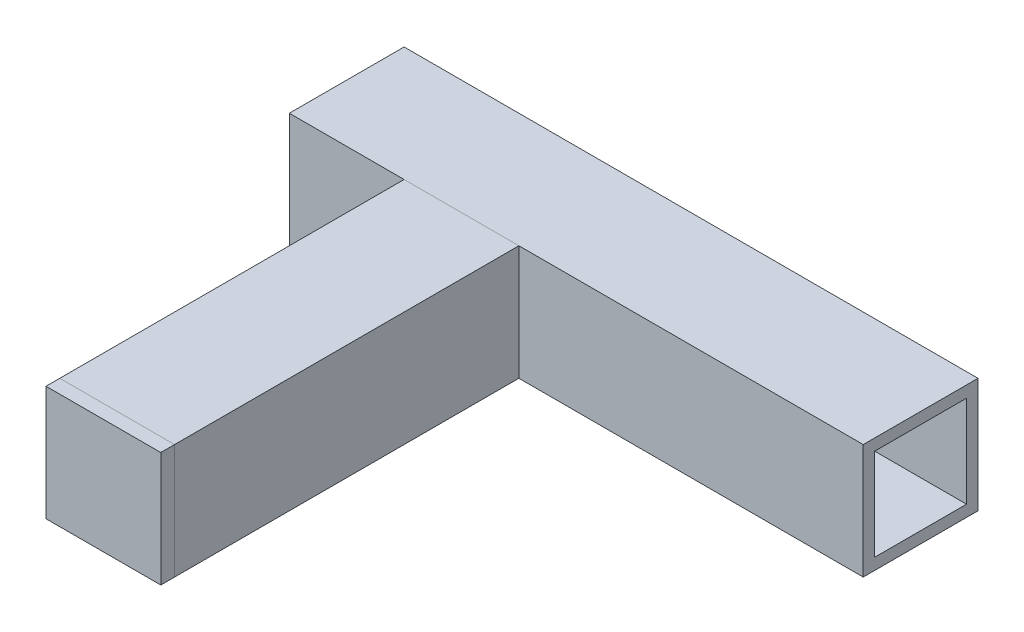
ISO-10303-21;
HEADER;
FILE_DESCRIPTION(('STEP AP214'),'2;1');
FILE_NAME('part.step','',(''),(''),'','','');
FILE_SCHEMA(('AUTOMOTIVE_DESIGN { 1 0 10303 214 1 1 1 1 }'));
ENDSEC;
DATA;
#1=APPLICATION_CONTEXT('core data for automotive mechanical design processes');
#2=APPLICATION_PROTOCOL_DEFINITION('international standard','automotive_design',2000,#1);
#3=PRODUCT_CONTEXT('',#1,'mechanical');
#4=PRODUCT('Part','Part','',(#3));
#5=PRODUCT_RELATED_PRODUCT_CATEGORY('part','',(#4));
#6=PRODUCT_DEFINITION_FORMATION('','',#4);
#7=PRODUCT_DEFINITION_CONTEXT('part definition',#1,'design');
#8=PRODUCT_DEFINITION('design','',#6,#7);
#9=PRODUCT_DEFINITION_SHAPE('','',#8);
#10=(LENGTH_UNIT() NAMED_UNIT(*) SI_UNIT(.MILLI.,.METRE.));
#11=(NAMED_UNIT(*) PLANE_ANGLE_UNIT() SI_UNIT($,.RADIAN.));
#12=(NAMED_UNIT(*) SI_UNIT($,.STERADIAN.) SOLID_ANGLE_UNIT());
#13=UNCERTAINTY_MEASURE_WITH_UNIT(LENGTH_MEASURE(1.E-05),#10,'distance_accuracy_value','');
#14=(GEOMETRIC_REPRESENTATION_CONTEXT(3) GLOBAL_UNCERTAINTY_ASSIGNED_CONTEXT((#13)) GLOBAL_UNIT_ASSIGNED_CONTEXT((#10,
#11,#12)) REPRESENTATION_CONTEXT('',''));
#15=CARTESIAN_POINT('',(0.,0.,0.));
#16=DIRECTION('',(0.,0.,1.));
#17=DIRECTION('',(1.,0.,0.));
#18=AXIS2_PLACEMENT_3D('',#15,#16,#17);
#19=CARTESIAN_POINT('',(24.99995,-24.99995,181.));
#20=DIRECTION('',(-1.,0.,0.));
#21=DIRECTION('',(0.,0.,1.));
#22=AXIS2_PLACEMENT_3D('',#19,#20,#21);
#23=PLANE('',#22);
#24=DIRECTION('',(0.,1.,0.));
#25=VECTOR('',#24,1.);
#26=CARTESIAN_POINT('',(24.99995,-24.99995,175.));
#27=LINE('',#26,#25);
#28=CARTESIAN_POINT('',(24.99995,-24.99995,175.));
#29=VERTEX_POINT('',#28);
#30=CARTESIAN_POINT('',(24.99995,24.99995,175.));
#31=VERTEX_POINT('',#30);
#32=EDGE_CURVE('P0_E79',#29,#31,#27,.T.);
#33=ORIENTED_EDGE('',*,*,#32,.T.);
#34=DIRECTION('',(0.,0.,-1.));
#35=VECTOR('',#34,1.);
#36=CARTESIAN_POINT('',(24.99995,24.99995,181.));
#37=LINE('',#36,#35);
#38=CARTESIAN_POINT('',(24.99995,24.99995,181.));
#39=VERTEX_POINT('',#38);
#40=EDGE_CURVE('P0_E11',#39,#31,#37,.T.);
#41=ORIENTED_EDGE('',*,*,#40,.F.);
#42=DIRECTION('',(0.,1.,0.));
#43=VECTOR('',#42,1.);
#44=CARTESIAN_POINT('',(24.99995,-24.99995,181.));
#45=LINE('',#44,#43);
#46=CARTESIAN_POINT('',(24.99995,-24.99995,181.));
#47=VERTEX_POINT('',#46);
#48=EDGE_CURVE('P0_E67',#47,#39,#45,.T.);
#49=ORIENTED_EDGE('',*,*,#48,.F.);
#50=DIRECTION('',(0.,0.,-1.));
#51=VECTOR('',#50,1.);
#52=CARTESIAN_POINT('',(24.99995,-24.99995,181.));
#53=LINE('',#52,#51);
#54=EDGE_CURVE('P0_E75',#47,#29,#53,.T.);
#55=ORIENTED_EDGE('',*,*,#54,.T.);
#56=EDGE_LOOP('',(#33,#41,#49,#55));
#57=FACE_BOUND('',#56,.T.);
#58=ADVANCED_FACE('P0_F16',(#57),#23,.F.);
#59=CARTESIAN_POINT('',(-24.99995,24.99995,181.));
#60=DIRECTION('',(0.,-1.,0.));
#61=DIRECTION('',(0.,0.,-1.));
#62=AXIS2_PLACEMENT_3D('',#59,#60,#61);
#63=PLANE('',#62);
#64=DIRECTION('',(-1.,0.,0.));
#65=VECTOR('',#64,1.);
#66=CARTESIAN_POINT('',(-24.99995,24.99995,175.));
#67=LINE('',#66,#65);
#68=CARTESIAN_POINT('',(-24.99995,24.99995,175.));
#69=VERTEX_POINT('',#68);
#70=EDGE_CURVE('P0_E71',#31,#69,#67,.T.);
#71=ORIENTED_EDGE('',*,*,#70,.T.);
#72=DIRECTION('',(0.,0.,-1.));
#73=VECTOR('',#72,1.);
#74=CARTESIAN_POINT('',(-24.99995,24.99995,181.));
#75=LINE('',#74,#73);
#76=CARTESIAN_POINT('',(-24.99995,24.99995,181.));
#77=VERTEX_POINT('',#76);
#78=EDGE_CURVE('P0_E24',#77,#69,#75,.T.);
#79=ORIENTED_EDGE('',*,*,#78,.F.);
#80=DIRECTION('',(-1.,0.,0.));
#81=VECTOR('',#80,1.);
#82=CARTESIAN_POINT('',(-24.99995,24.99995,181.));
#83=LINE('',#82,#81);
#84=EDGE_CURVE('P0_E62',#39,#77,#83,.T.);
#85=ORIENTED_EDGE('',*,*,#84,.F.);
#86=ORIENTED_EDGE('',*,*,#40,.T.);
#87=EDGE_LOOP('',(#71,#79,#85,#86));
#88=FACE_BOUND('',#87,.T.);
#89=ADVANCED_FACE('P0_F70',(#88),#63,.F.);
#90=CARTESIAN_POINT('',(-24.99995,-24.99995,181.));
#91=DIRECTION('',(1.,0.,0.));
#92=DIRECTION('',(0.,0.,-1.));
#93=AXIS2_PLACEMENT_3D('',#90,#91,#92);
#94=PLANE('',#93);
#95=DIRECTION('',(0.,-1.,0.));
#96=VECTOR('',#95,1.);
#97=CARTESIAN_POINT('',(-24.99995,-24.99995,175.));
#98=LINE('',#97,#96);
#99=CARTESIAN_POINT('',(-24.99995,-24.99995,175.));
#100=VERTEX_POINT('',#99);
#101=EDGE_CURVE('P0_E49',#69,#100,#98,.T.);
#102=ORIENTED_EDGE('',*,*,#101,.T.);
#103=DIRECTION('',(0.,0.,-1.));
#104=VECTOR('',#103,1.);
#105=CARTESIAN_POINT('',(-24.99995,-24.99995,181.));
#106=LINE('',#105,#104);
#107=CARTESIAN_POINT('',(-24.99995,-24.99995,181.));
#108=VERTEX_POINT('',#107);
#109=EDGE_CURVE('P0_E72',#108,#100,#106,.T.);
#110=ORIENTED_EDGE('',*,*,#109,.F.);
#111=DIRECTION('',(0.,-1.,0.));
#112=VECTOR('',#111,1.);
#113=CARTESIAN_POINT('',(-24.99995,-24.99995,181.));
#114=LINE('',#113,#112);
#115=EDGE_CURVE('P0_E65',#77,#108,#114,.T.);
#116=ORIENTED_EDGE('',*,*,#115,.F.);
#117=ORIENTED_EDGE('',*,*,#78,.T.);
#118=EDGE_LOOP('',(#102,#110,#116,#117));
#119=FACE_BOUND('',#118,.T.);
#120=ADVANCED_FACE('P0_F73',(#119),#94,.F.);
#121=CARTESIAN_POINT('',(-24.99995,-24.99995,181.));
#122=DIRECTION('',(0.,1.,0.));
#123=DIRECTION('',(0.,0.,1.));
#124=AXIS2_PLACEMENT_3D('',#121,#122,#123);
#125=PLANE('',#124);
#126=DIRECTION('',(1.,0.,0.));
#127=VECTOR('',#126,1.);
#128=CARTESIAN_POINT('',(-24.99995,-24.99995,175.));
#129=LINE('',#128,#127);
#130=EDGE_CURVE('P0_E55',#100,#29,#129,.T.);
#131=ORIENTED_EDGE('',*,*,#130,.T.);
#132=ORIENTED_EDGE('',*,*,#54,.F.);
#133=DIRECTION('',(1.,0.,0.));
#134=VECTOR('',#133,1.);
#135=CARTESIAN_POINT('',(-24.99995,-24.99995,181.));
#136=LINE('',#135,#134);
#137=EDGE_CURVE('P0_E32',#108,#47,#136,.T.);
#138=ORIENTED_EDGE('',*,*,#137,.F.);
#139=ORIENTED_EDGE('',*,*,#109,.T.);
#140=EDGE_LOOP('',(#131,#132,#138,#139));
#141=FACE_BOUND('',#140,.T.);
#142=ADVANCED_FACE('P0_F86',(#141),#125,.F.);
#143=CARTESIAN_POINT('',(0.,0.,181.));
#144=DIRECTION('',(0.,0.,-1.));
#145=DIRECTION('',(-1.,0.,0.));
#146=AXIS2_PLACEMENT_3D('',#143,#144,#145);
#147=PLANE('',#146);
#148=ORIENTED_EDGE('',*,*,#48,.T.);
#149=ORIENTED_EDGE('',*,*,#84,.T.);
#150=ORIENTED_EDGE('',*,*,#115,.T.);
#151=ORIENTED_EDGE('',*,*,#137,.T.);
#152=EDGE_LOOP('',(#148,#149,#150,#151));
#153=FACE_BOUND('',#152,.T.);
#154=ADVANCED_FACE('P0_F63',(#153),#147,.F.);
#155=CARTESIAN_POINT('',(0.,0.,175.));
#156=DIRECTION('',(0.,0.,-1.));
#157=DIRECTION('',(-1.,0.,0.));
#158=AXIS2_PLACEMENT_3D('',#155,#156,#157);
#159=PLANE('',#158);
#160=ORIENTED_EDGE('',*,*,#32,.F.);
#161=ORIENTED_EDGE('',*,*,#130,.F.);
#162=ORIENTED_EDGE('',*,*,#101,.F.);
#163=ORIENTED_EDGE('',*,*,#70,.F.);
#164=EDGE_LOOP('',(#160,#161,#162,#163));
#165=FACE_BOUND('',#164,.T.);
#166=ADVANCED_FACE('P0_F89',(#165),#159,.T.);
#167=CLOSED_SHELL('',(#58,#89,#120,#142,#154,#166));
#168=MANIFOLD_SOLID_BREP('P0_B1',#167);
#169=CARTESIAN_POINT('',(0.,0.,175.));
#170=DIRECTION('',(0.,0.,1.));
#171=DIRECTION('',(1.,0.,0.));
#172=AXIS2_PLACEMENT_3D('',#169,#170,#171);
#173=PLANE('',#172);
#174=DIRECTION('',(0.,-1.,0.));
#175=VECTOR('',#174,1.);
#176=CARTESIAN_POINT('',(-25.,25.,175.));
#177=LINE('',#176,#175);
#178=CARTESIAN_POINT('',(-25.,25.,175.));
#179=VERTEX_POINT('',#178);
#180=CARTESIAN_POINT('',(-25.,-25.,175.));
#181=VERTEX_POINT('',#180);
#182=EDGE_CURVE('P1_E117',#179,#181,#177,.T.);
#183=ORIENTED_EDGE('',*,*,#182,.T.);
#184=DIRECTION('',(1.,0.,0.));
#185=VECTOR('',#184,1.);
#186=CARTESIAN_POINT('',(-25.,-25.,175.));
#187=LINE('',#186,#185);
#188=CARTESIAN_POINT('',(25.,-25.,175.));
#189=VERTEX_POINT('',#188);
#190=EDGE_CURVE('P1_E120',#181,#189,#187,.T.);
#191=ORIENTED_EDGE('',*,*,#190,.T.);
#192=DIRECTION('',(0.,1.,0.));
#193=VECTOR('',#192,1.);
#194=CARTESIAN_POINT('',(25.,25.,175.));
#195=LINE('',#194,#193);
#196=CARTESIAN_POINT('',(25.,25.,175.));
#197=VERTEX_POINT('',#196);
#198=EDGE_CURVE('P1_E123',#189,#197,#195,.T.);
#199=ORIENTED_EDGE('',*,*,#198,.T.);
#200=DIRECTION('',(-1.,0.,0.));
#201=VECTOR('',#200,1.);
#202=CARTESIAN_POINT('',(-25.,25.,175.));
#203=LINE('',#202,#201);
#204=EDGE_CURVE('P1_E125',#197,#179,#203,.T.);
#205=ORIENTED_EDGE('',*,*,#204,.T.);
#206=EDGE_LOOP('',(#183,#191,#199,#205));
#207=FACE_BOUND('',#206,.T.);
#208=DIRECTION('',(0.,-1.,0.));
#209=VECTOR('',#208,1.);
#210=CARTESIAN_POINT('',(-20.,20.,175.));
#211=LINE('',#210,#209);
#212=CARTESIAN_POINT('',(-20.,20.,175.));
#213=VERTEX_POINT('',#212);
#214=CARTESIAN_POINT('',(-20.,-20.,175.));
#215=VERTEX_POINT('',#214);
#216=EDGE_CURVE('P1_E89',#213,#215,#211,.T.);
#217=ORIENTED_EDGE('',*,*,#216,.F.);
#218=DIRECTION('',(-1.,0.,0.));
#219=VECTOR('',#218,1.);
#220=CARTESIAN_POINT('',(-20.,20.,175.));
#221=LINE('',#220,#219);
#222=CARTESIAN_POINT('',(20.,20.,175.));
#223=VERTEX_POINT('',#222);
#224=EDGE_CURVE('P1_E81',#223,#213,#221,.T.);
#225=ORIENTED_EDGE('',*,*,#224,.F.);
#226=DIRECTION('',(0.,1.,0.));
#227=VECTOR('',#226,1.);
#228=CARTESIAN_POINT('',(20.,20.,175.));
#229=LINE('',#228,#227);
#230=CARTESIAN_POINT('',(20.,-20.,175.));
#231=VERTEX_POINT('',#230);
#232=EDGE_CURVE('P1_E103',#231,#223,#229,.T.);
#233=ORIENTED_EDGE('',*,*,#232,.F.);
#234=DIRECTION('',(1.,0.,0.));
#235=VECTOR('',#234,1.);
#236=CARTESIAN_POINT('',(-20.,-20.,175.));
#237=LINE('',#236,#235);
#238=EDGE_CURVE('P1_E101',#215,#231,#237,.T.);
#239=ORIENTED_EDGE('',*,*,#238,.F.);
#240=EDGE_LOOP('',(#217,#225,#233,#239));
#241=FACE_BOUND('',#240,.T.);
#242=ADVANCED_FACE('P1_F16',(#207,#241),#173,.T.);
#243=CARTESIAN_POINT('',(0.,0.,25.));
#244=DIRECTION('',(0.,0.,1.));
#245=DIRECTION('',(1.,0.,0.));
#246=AXIS2_PLACEMENT_3D('',#243,#244,#245);
#247=PLANE('',#246);
#248=DIRECTION('',(0.,-1.,0.));
#249=VECTOR('',#248,1.);
#250=CARTESIAN_POINT('',(-25.,25.,25.));
#251=LINE('',#250,#249);
#252=CARTESIAN_POINT('',(-25.,25.,25.));
#253=VERTEX_POINT('',#252);
#254=CARTESIAN_POINT('',(-25.,-25.,25.));
#255=VERTEX_POINT('',#254);
#256=EDGE_CURVE('P1_E97',#253,#255,#251,.T.);
#257=ORIENTED_EDGE('',*,*,#256,.F.);
#258=DIRECTION('',(-1.,0.,0.));
#259=VECTOR('',#258,1.);
#260=CARTESIAN_POINT('',(-25.,25.,25.));
#261=LINE('',#260,#259);
#262=CARTESIAN_POINT('',(25.,25.,25.));
#263=VERTEX_POINT('',#262);
#264=EDGE_CURVE('P1_E121',#263,#253,#261,.T.);
#265=ORIENTED_EDGE('',*,*,#264,.F.);
#266=DIRECTION('',(0.,1.,0.));
#267=VECTOR('',#266,1.);
#268=CARTESIAN_POINT('',(25.,25.,25.));
#269=LINE('',#268,#267);
#270=CARTESIAN_POINT('',(25.,-25.,25.));
#271=VERTEX_POINT('',#270);
#272=EDGE_CURVE('P1_E132',#271,#263,#269,.T.);
#273=ORIENTED_EDGE('',*,*,#272,.F.);
#274=DIRECTION('',(1.,0.,0.));
#275=VECTOR('',#274,1.);
#276=CARTESIAN_POINT('',(-25.,-25.,25.));
#277=LINE('',#276,#275);
#278=EDGE_CURVE('P1_E130',#255,#271,#277,.T.);
#279=ORIENTED_EDGE('',*,*,#278,.F.);
#280=EDGE_LOOP('',(#257,#265,#273,#279));
#281=FACE_BOUND('',#280,.T.);
#282=DIRECTION('',(-1.,0.,0.));
#283=VECTOR('',#282,1.);
#284=CARTESIAN_POINT('',(-20.,20.,25.));
#285=LINE('',#284,#283);
#286=CARTESIAN_POINT('',(20.,20.,25.));
#287=VERTEX_POINT('',#286);
#288=CARTESIAN_POINT('',(-20.,20.,25.));
#289=VERTEX_POINT('',#288);
#290=EDGE_CURVE('P1_E39',#287,#289,#285,.T.);
#291=ORIENTED_EDGE('',*,*,#290,.T.);
#292=DIRECTION('',(0.,-1.,0.));
#293=VECTOR('',#292,1.);
#294=CARTESIAN_POINT('',(-20.,20.,25.));
#295=LINE('',#294,#293);
#296=CARTESIAN_POINT('',(-20.,-20.,25.));
#297=VERTEX_POINT('',#296);
#298=EDGE_CURVE('P1_E96',#289,#297,#295,.T.);
#299=ORIENTED_EDGE('',*,*,#298,.T.);
#300=DIRECTION('',(1.,0.,0.));
#301=VECTOR('',#300,1.);
#302=CARTESIAN_POINT('',(-20.,-20.,25.));
#303=LINE('',#302,#301);
#304=CARTESIAN_POINT('',(20.,-20.,25.));
#305=VERTEX_POINT('',#304);
#306=EDGE_CURVE('P1_E109',#297,#305,#303,.T.);
#307=ORIENTED_EDGE('',*,*,#306,.T.);
#308=DIRECTION('',(0.,1.,0.));
#309=VECTOR('',#308,1.);
#310=CARTESIAN_POINT('',(20.,20.,25.));
#311=LINE('',#310,#309);
#312=EDGE_CURVE('P1_E90',#305,#287,#311,.T.);
#313=ORIENTED_EDGE('',*,*,#312,.T.);
#314=EDGE_LOOP('',(#291,#299,#307,#313));
#315=FACE_BOUND('',#314,.T.);
#316=ADVANCED_FACE('P1_F150',(#281,#315),#247,.F.);
#317=CARTESIAN_POINT('',(-25.,25.,175.));
#318=DIRECTION('',(1.,0.,0.));
#319=DIRECTION('',(0.,1.,0.));
#320=AXIS2_PLACEMENT_3D('',#317,#318,#319);
#321=PLANE('',#320);
#322=ORIENTED_EDGE('',*,*,#256,.T.);
#323=DIRECTION('',(0.,0.,-1.));
#324=VECTOR('',#323,1.);
#325=CARTESIAN_POINT('',(-25.,-25.,175.));
#326=LINE('',#325,#324);
#327=EDGE_CURVE('P1_E11',#181,#255,#326,.T.);
#328=ORIENTED_EDGE('',*,*,#327,.F.);
#329=ORIENTED_EDGE('',*,*,#182,.F.);
#330=DIRECTION('',(0.,0.,-1.));
#331=VECTOR('',#330,1.);
#332=CARTESIAN_POINT('',(-25.,25.,175.));
#333=LINE('',#332,#331);
#334=EDGE_CURVE('P1_E127',#179,#253,#333,.T.);
#335=ORIENTED_EDGE('',*,*,#334,.T.);
#336=EDGE_LOOP('',(#322,#328,#329,#335));
#337=FACE_BOUND('',#336,.T.);
#338=ADVANCED_FACE('P1_F18',(#337),#321,.F.);
#339=CARTESIAN_POINT('',(-25.,-25.,175.));
#340=DIRECTION('',(0.,1.,0.));
#341=DIRECTION('',(0.,0.,1.));
#342=AXIS2_PLACEMENT_3D('',#339,#340,#341);
#343=PLANE('',#342);
#344=ORIENTED_EDGE('',*,*,#278,.T.);
#345=DIRECTION('',(0.,0.,-1.));
#346=VECTOR('',#345,1.);
#347=CARTESIAN_POINT('',(25.,-25.,175.));
#348=LINE('',#347,#346);
#349=EDGE_CURVE('P1_E24',#189,#271,#348,.T.);
#350=ORIENTED_EDGE('',*,*,#349,.F.);
#351=ORIENTED_EDGE('',*,*,#190,.F.);
#352=ORIENTED_EDGE('',*,*,#327,.T.);
#353=EDGE_LOOP('',(#344,#350,#351,#352));
#354=FACE_BOUND('',#353,.T.);
#355=ADVANCED_FACE('P1_F160',(#354),#343,.F.);
#356=CARTESIAN_POINT('',(25.,25.,175.));
#357=DIRECTION('',(-1.,0.,0.));
#358=DIRECTION('',(0.,-1.,0.));
#359=AXIS2_PLACEMENT_3D('',#356,#357,#358);
#360=PLANE('',#359);
#361=ORIENTED_EDGE('',*,*,#272,.T.);
#362=DIRECTION('',(0.,0.,-1.));
#363=VECTOR('',#362,1.);
#364=CARTESIAN_POINT('',(25.,25.,175.));
#365=LINE('',#364,#363);
#366=EDGE_CURVE('P1_E137',#197,#263,#365,.T.);
#367=ORIENTED_EDGE('',*,*,#366,.F.);
#368=ORIENTED_EDGE('',*,*,#198,.F.);
#369=ORIENTED_EDGE('',*,*,#349,.T.);
#370=EDGE_LOOP('',(#361,#367,#368,#369));
#371=FACE_BOUND('',#370,.T.);
#372=ADVANCED_FACE('P1_F144',(#371),#360,.F.);
#373=CARTESIAN_POINT('',(-25.,25.,175.));
#374=DIRECTION('',(0.,-1.,0.));
#375=DIRECTION('',(0.,0.,-1.));
#376=AXIS2_PLACEMENT_3D('',#373,#374,#375);
#377=PLANE('',#376);
#378=ORIENTED_EDGE('',*,*,#264,.T.);
#379=ORIENTED_EDGE('',*,*,#334,.F.);
#380=ORIENTED_EDGE('',*,*,#204,.F.);
#381=ORIENTED_EDGE('',*,*,#366,.T.);
#382=EDGE_LOOP('',(#378,#379,#380,#381));
#383=FACE_BOUND('',#382,.T.);
#384=ADVANCED_FACE('P1_F154',(#383),#377,.F.);
#385=CARTESIAN_POINT('',(-20.,20.,175.));
#386=DIRECTION('',(0.,-1.,0.));
#387=DIRECTION('',(0.,0.,-1.));
#388=AXIS2_PLACEMENT_3D('',#385,#386,#387);
#389=PLANE('',#388);
#390=ORIENTED_EDGE('',*,*,#290,.F.);
#391=DIRECTION('',(0.,0.,-1.));
#392=VECTOR('',#391,1.);
#393=CARTESIAN_POINT('',(20.,20.,175.));
#394=LINE('',#393,#392);
#395=EDGE_CURVE('P1_E85',#223,#287,#394,.T.);
#396=ORIENTED_EDGE('',*,*,#395,.F.);
#397=ORIENTED_EDGE('',*,*,#224,.T.);
#398=DIRECTION('',(0.,0.,-1.));
#399=VECTOR('',#398,1.);
#400=CARTESIAN_POINT('',(-20.,20.,175.));
#401=LINE('',#400,#399);
#402=EDGE_CURVE('P1_E84',#213,#289,#401,.T.);
#403=ORIENTED_EDGE('',*,*,#402,.T.);
#404=EDGE_LOOP('',(#390,#396,#397,#403));
#405=FACE_BOUND('',#404,.T.);
#406=ADVANCED_FACE('P1_F83',(#405),#389,.T.);
#407=CARTESIAN_POINT('',(-20.,20.,175.));
#408=DIRECTION('',(1.,0.,0.));
#409=DIRECTION('',(0.,1.,0.));
#410=AXIS2_PLACEMENT_3D('',#407,#408,#409);
#411=PLANE('',#410);
#412=ORIENTED_EDGE('',*,*,#298,.F.);
#413=ORIENTED_EDGE('',*,*,#402,.F.);
#414=ORIENTED_EDGE('',*,*,#216,.T.);
#415=DIRECTION('',(0.,0.,-1.));
#416=VECTOR('',#415,1.);
#417=CARTESIAN_POINT('',(-20.,-20.,175.));
#418=LINE('',#417,#416);
#419=EDGE_CURVE('P1_E98',#215,#297,#418,.T.);
#420=ORIENTED_EDGE('',*,*,#419,.T.);
#421=EDGE_LOOP('',(#412,#413,#414,#420));
#422=FACE_BOUND('',#421,.T.);
#423=ADVANCED_FACE('P1_F93',(#422),#411,.T.);
#424=CARTESIAN_POINT('',(-20.,-20.,175.));
#425=DIRECTION('',(0.,1.,0.));
#426=DIRECTION('',(0.,0.,1.));
#427=AXIS2_PLACEMENT_3D('',#424,#425,#426);
#428=PLANE('',#427);
#429=ORIENTED_EDGE('',*,*,#306,.F.);
#430=ORIENTED_EDGE('',*,*,#419,.F.);
#431=ORIENTED_EDGE('',*,*,#238,.T.);
#432=DIRECTION('',(0.,0.,-1.));
#433=VECTOR('',#432,1.);
#434=CARTESIAN_POINT('',(20.,-20.,175.));
#435=LINE('',#434,#433);
#436=EDGE_CURVE('P1_E31',#231,#305,#435,.T.);
#437=ORIENTED_EDGE('',*,*,#436,.T.);
#438=EDGE_LOOP('',(#429,#430,#431,#437));
#439=FACE_BOUND('',#438,.T.);
#440=ADVANCED_FACE('P1_F184',(#439),#428,.T.);
#441=CARTESIAN_POINT('',(20.,20.,175.));
#442=DIRECTION('',(-1.,0.,0.));
#443=DIRECTION('',(0.,-1.,0.));
#444=AXIS2_PLACEMENT_3D('',#441,#442,#443);
#445=PLANE('',#444);
#446=ORIENTED_EDGE('',*,*,#312,.F.);
#447=ORIENTED_EDGE('',*,*,#436,.F.);
#448=ORIENTED_EDGE('',*,*,#232,.T.);
#449=ORIENTED_EDGE('',*,*,#395,.T.);
#450=EDGE_LOOP('',(#446,#447,#448,#449));
#451=FACE_BOUND('',#450,.T.);
#452=ADVANCED_FACE('P1_F188',(#451),#445,.T.);
#453=CLOSED_SHELL('',(#242,#316,#338,#355,#372,#384,#406,#423,#440,#452));
#454=MANIFOLD_SOLID_BREP('P1_B1',#453);
#455=CARTESIAN_POINT('',(-75.,-25.,25.));
#456=DIRECTION('',(0.,-1.,0.));
#457=DIRECTION('',(0.,0.,-1.));
#458=AXIS2_PLACEMENT_3D('',#455,#456,#457);
#459=PLANE('',#458);
#460=DIRECTION('',(1.,0.,0.));
#461=VECTOR('',#460,1.);
#462=CARTESIAN_POINT('',(-75.,-25.,-25.));
#463=LINE('',#462,#461);
#464=CARTESIAN_POINT('',(-75.,-25.,-25.));
#465=VERTEX_POINT('',#464);
#466=CARTESIAN_POINT('',(175.,-25.,-25.));
#467=VERTEX_POINT('',#466);
#468=EDGE_CURVE('P2_E18',#465,#467,#463,.T.);
#469=ORIENTED_EDGE('',*,*,#468,.T.);
#470=DIRECTION('',(0.,0.,-1.));
#471=VECTOR('',#470,1.);
#472=CARTESIAN_POINT('',(175.,-25.,25.));
#473=LINE('',#472,#471);
#474=CARTESIAN_POINT('',(175.,-25.,25.));
#475=VERTEX_POINT('',#474);
#476=EDGE_CURVE('P2_E110',#475,#467,#473,.T.);
#477=ORIENTED_EDGE('',*,*,#476,.F.);
#478=DIRECTION('',(1.,0.,0.));
#479=VECTOR('',#478,1.);
#480=CARTESIAN_POINT('',(-75.,-25.,25.));
#481=LINE('',#480,#479);
#482=CARTESIAN_POINT('',(-75.,-25.,25.));
#483=VERTEX_POINT('',#482);
#484=EDGE_CURVE('P2_E10',#483,#475,#481,.T.);
#485=ORIENTED_EDGE('',*,*,#484,.F.);
#486=DIRECTION('',(0.,0.,-1.));
#487=VECTOR('',#486,1.);
#488=CARTESIAN_POINT('',(-75.,-25.,25.));
#489=LINE('',#488,#487);
#490=EDGE_CURVE('P2_E129',#483,#465,#489,.T.);
#491=ORIENTED_EDGE('',*,*,#490,.T.);
#492=EDGE_LOOP('',(#469,#477,#485,#491));
#493=FACE_BOUND('',#492,.T.);
#494=ADVANCED_FACE('P2_F15',(#493),#459,.T.);
#495=CARTESIAN_POINT('',(-75.,-25.,25.));
#496=DIRECTION('',(0.,0.,1.));
#497=DIRECTION('',(1.,0.,0.));
#498=AXIS2_PLACEMENT_3D('',#495,#496,#497);
#499=PLANE('',#498);
#500=ORIENTED_EDGE('',*,*,#484,.T.);
#501=DIRECTION('',(0.,-1.,0.));
#502=VECTOR('',#501,1.);
#503=CARTESIAN_POINT('',(175.,-25.,25.));
#504=LINE('',#503,#502);
#505=CARTESIAN_POINT('',(175.,25.,25.));
#506=VERTEX_POINT('',#505);
#507=EDGE_CURVE('P2_E119',#506,#475,#504,.T.);
#508=ORIENTED_EDGE('',*,*,#507,.F.);
#509=DIRECTION('',(1.,0.,0.));
#510=VECTOR('',#509,1.);
#511=CARTESIAN_POINT('',(-75.,25.,25.));
#512=LINE('',#511,#510);
#513=CARTESIAN_POINT('',(-75.,25.,25.));
#514=VERTEX_POINT('',#513);
#515=EDGE_CURVE('P2_E23',#514,#506,#512,.T.);
#516=ORIENTED_EDGE('',*,*,#515,.F.);
#517=DIRECTION('',(0.,-1.,0.));
#518=VECTOR('',#517,1.);
#519=CARTESIAN_POINT('',(-75.,-25.,25.));
#520=LINE('',#519,#518);
#521=EDGE_CURVE('P2_E140',#514,#483,#520,.T.);
#522=ORIENTED_EDGE('',*,*,#521,.T.);
#523=EDGE_LOOP('',(#500,#508,#516,#522));
#524=FACE_BOUND('',#523,.T.);
#525=ADVANCED_FACE('P2_F152',(#524),#499,.T.);
#526=CARTESIAN_POINT('',(-75.,25.,25.));
#527=DIRECTION('',(0.,1.,0.));
#528=DIRECTION('',(0.,0.,1.));
#529=AXIS2_PLACEMENT_3D('',#526,#527,#528);
#530=PLANE('',#529);
#531=ORIENTED_EDGE('',*,*,#515,.T.);
#532=DIRECTION('',(0.,0.,1.));
#533=VECTOR('',#532,1.);
#534=CARTESIAN_POINT('',(175.,25.,25.));
#535=LINE('',#534,#533);
#536=CARTESIAN_POINT('',(175.,25.,-25.));
#537=VERTEX_POINT('',#536);
#538=EDGE_CURVE('P2_E116',#537,#506,#535,.T.);
#539=ORIENTED_EDGE('',*,*,#538,.F.);
#540=DIRECTION('',(1.,0.,0.));
#541=VECTOR('',#540,1.);
#542=CARTESIAN_POINT('',(-75.,25.,-25.));
#543=LINE('',#542,#541);
#544=CARTESIAN_POINT('',(-75.,25.,-25.));
#545=VERTEX_POINT('',#544);
#546=EDGE_CURVE('P2_E143',#545,#537,#543,.T.);
#547=ORIENTED_EDGE('',*,*,#546,.F.);
#548=DIRECTION('',(0.,0.,1.));
#549=VECTOR('',#548,1.);
#550=CARTESIAN_POINT('',(-75.,25.,25.));
#551=LINE('',#550,#549);
#552=EDGE_CURVE('P2_E137',#545,#514,#551,.T.);
#553=ORIENTED_EDGE('',*,*,#552,.T.);
#554=EDGE_LOOP('',(#531,#539,#547,#553));
#555=FACE_BOUND('',#554,.T.);
#556=ADVANCED_FACE('P2_F158',(#555),#530,.T.);
#557=CARTESIAN_POINT('',(-75.,-25.,-25.));
#558=DIRECTION('',(0.,0.,-1.));
#559=DIRECTION('',(-1.,0.,0.));
#560=AXIS2_PLACEMENT_3D('',#557,#558,#559);
#561=PLANE('',#560);
#562=ORIENTED_EDGE('',*,*,#546,.T.);
#563=DIRECTION('',(0.,1.,0.));
#564=VECTOR('',#563,1.);
#565=CARTESIAN_POINT('',(175.,-25.,-25.));
#566=LINE('',#565,#564);
#567=EDGE_CURVE('P2_E113',#467,#537,#566,.T.);
#568=ORIENTED_EDGE('',*,*,#567,.F.);
#569=ORIENTED_EDGE('',*,*,#468,.F.);
#570=DIRECTION('',(0.,1.,0.));
#571=VECTOR('',#570,1.);
#572=CARTESIAN_POINT('',(-75.,-25.,-25.));
#573=LINE('',#572,#571);
#574=EDGE_CURVE('P2_E134',#465,#545,#573,.T.);
#575=ORIENTED_EDGE('',*,*,#574,.T.);
#576=EDGE_LOOP('',(#562,#568,#569,#575));
#577=FACE_BOUND('',#576,.T.);
#578=ADVANCED_FACE('P2_F147',(#577),#561,.T.);
#579=CARTESIAN_POINT('',(-75.,0.,0.));
#580=DIRECTION('',(1.,0.,0.));
#581=DIRECTION('',(0.,1.,0.));
#582=AXIS2_PLACEMENT_3D('',#579,#580,#581);
#583=PLANE('',#582);
#584=DIRECTION('',(0.,0.,1.));
#585=VECTOR('',#584,1.);
#586=CARTESIAN_POINT('',(-75.,20.,20.));
#587=LINE('',#586,#585);
#588=CARTESIAN_POINT('',(-75.,20.,-20.));
#589=VERTEX_POINT('',#588);
#590=CARTESIAN_POINT('',(-75.,20.,20.));
#591=VERTEX_POINT('',#590);
#592=EDGE_CURVE('P2_E92',#589,#591,#587,.T.);
#593=ORIENTED_EDGE('',*,*,#592,.T.);
#594=DIRECTION('',(0.,-1.,0.));
#595=VECTOR('',#594,1.);
#596=CARTESIAN_POINT('',(-75.,-20.,20.));
#597=LINE('',#596,#595);
#598=CARTESIAN_POINT('',(-75.,-20.,20.));
#599=VERTEX_POINT('',#598);
#600=EDGE_CURVE('P2_E122',#591,#599,#597,.T.);
#601=ORIENTED_EDGE('',*,*,#600,.T.);
#602=DIRECTION('',(0.,0.,-1.));
#603=VECTOR('',#602,1.);
#604=CARTESIAN_POINT('',(-75.,-20.,20.));
#605=LINE('',#604,#603);
#606=CARTESIAN_POINT('',(-75.,-20.,-20.));
#607=VERTEX_POINT('',#606);
#608=EDGE_CURVE('P2_E87',#599,#607,#605,.T.);
#609=ORIENTED_EDGE('',*,*,#608,.T.);
#610=DIRECTION('',(0.,1.,0.));
#611=VECTOR('',#610,1.);
#612=CARTESIAN_POINT('',(-75.,-20.,-20.));
#613=LINE('',#612,#611);
#614=EDGE_CURVE('P2_E31',#607,#589,#613,.T.);
#615=ORIENTED_EDGE('',*,*,#614,.T.);
#616=EDGE_LOOP('',(#593,#601,#609,#615));
#617=FACE_BOUND('',#616,.T.);
#618=ORIENTED_EDGE('',*,*,#490,.F.);
#619=ORIENTED_EDGE('',*,*,#521,.F.);
#620=ORIENTED_EDGE('',*,*,#552,.F.);
#621=ORIENTED_EDGE('',*,*,#574,.F.);
#622=EDGE_LOOP('',(#618,#619,#620,#621));
#623=FACE_BOUND('',#622,.T.);
#624=ADVANCED_FACE('P2_F156',(#617,#623),#583,.F.);
#625=CARTESIAN_POINT('',(-75.,-20.,20.));
#626=DIRECTION('',(0.,0.,1.));
#627=DIRECTION('',(1.,0.,0.));
#628=AXIS2_PLACEMENT_3D('',#625,#626,#627);
#629=PLANE('',#628);
#630=DIRECTION('',(1.,0.,0.));
#631=VECTOR('',#630,1.);
#632=CARTESIAN_POINT('',(-75.,20.,20.));
#633=LINE('',#632,#631);
#634=CARTESIAN_POINT('',(175.,20.,20.));
#635=VERTEX_POINT('',#634);
#636=EDGE_CURVE('P2_E97',#591,#635,#633,.T.);
#637=ORIENTED_EDGE('',*,*,#636,.T.);
#638=DIRECTION('',(0.,-1.,0.));
#639=VECTOR('',#638,1.);
#640=CARTESIAN_POINT('',(175.,-20.,20.));
#641=LINE('',#640,#639);
#642=CARTESIAN_POINT('',(175.,-20.,20.));
#643=VERTEX_POINT('',#642);
#644=EDGE_CURVE('P2_E95',#635,#643,#641,.T.);
#645=ORIENTED_EDGE('',*,*,#644,.T.);
#646=DIRECTION('',(1.,0.,0.));
#647=VECTOR('',#646,1.);
#648=CARTESIAN_POINT('',(-75.,-20.,20.));
#649=LINE('',#648,#647);
#650=EDGE_CURVE('P2_E80',#599,#643,#649,.T.);
#651=ORIENTED_EDGE('',*,*,#650,.F.);
#652=ORIENTED_EDGE('',*,*,#600,.F.);
#653=EDGE_LOOP('',(#637,#645,#651,#652));
#654=FACE_BOUND('',#653,.T.);
#655=ADVANCED_FACE('P2_F96',(#654),#629,.F.);
#656=CARTESIAN_POINT('',(-75.,20.,20.));
#657=DIRECTION('',(0.,1.,0.));
#658=DIRECTION('',(0.,0.,1.));
#659=AXIS2_PLACEMENT_3D('',#656,#657,#658);
#660=PLANE('',#659);
#661=DIRECTION('',(1.,0.,0.));
#662=VECTOR('',#661,1.);
#663=CARTESIAN_POINT('',(-75.,20.,-20.));
#664=LINE('',#663,#662);
#665=CARTESIAN_POINT('',(175.,20.,-20.));
#666=VERTEX_POINT('',#665);
#667=EDGE_CURVE('P2_E130',#589,#666,#664,.T.);
#668=ORIENTED_EDGE('',*,*,#667,.T.);
#669=DIRECTION('',(0.,0.,1.));
#670=VECTOR('',#669,1.);
#671=CARTESIAN_POINT('',(175.,20.,20.));
#672=LINE('',#671,#670);
#673=EDGE_CURVE('P2_E106',#666,#635,#672,.T.);
#674=ORIENTED_EDGE('',*,*,#673,.T.);
#675=ORIENTED_EDGE('',*,*,#636,.F.);
#676=ORIENTED_EDGE('',*,*,#592,.F.);
#677=EDGE_LOOP('',(#668,#674,#675,#676));
#678=FACE_BOUND('',#677,.T.);
#679=ADVANCED_FACE('P2_F207',(#678),#660,.F.);
#680=CARTESIAN_POINT('',(-75.,-20.,-20.));
#681=DIRECTION('',(0.,0.,-1.));
#682=DIRECTION('',(-1.,0.,0.));
#683=AXIS2_PLACEMENT_3D('',#680,#681,#682);
#684=PLANE('',#683);
#685=DIRECTION('',(1.,0.,0.));
#686=VECTOR('',#685,1.);
#687=CARTESIAN_POINT('',(-75.,-20.,-20.));
#688=LINE('',#687,#686);
#689=CARTESIAN_POINT('',(175.,-20.,-20.));
#690=VERTEX_POINT('',#689);
#691=EDGE_CURVE('P2_E91',#607,#690,#688,.T.);
#692=ORIENTED_EDGE('',*,*,#691,.T.);
#693=DIRECTION('',(0.,1.,0.));
#694=VECTOR('',#693,1.);
#695=CARTESIAN_POINT('',(175.,-20.,-20.));
#696=LINE('',#695,#694);
#697=EDGE_CURVE('P2_E104',#690,#666,#696,.T.);
#698=ORIENTED_EDGE('',*,*,#697,.T.);
#699=ORIENTED_EDGE('',*,*,#667,.F.);
#700=ORIENTED_EDGE('',*,*,#614,.F.);
#701=EDGE_LOOP('',(#692,#698,#699,#700));
#702=FACE_BOUND('',#701,.T.);
#703=ADVANCED_FACE('P2_F216',(#702),#684,.F.);
#704=CARTESIAN_POINT('',(-75.,-20.,20.));
#705=DIRECTION('',(0.,-1.,0.));
#706=DIRECTION('',(0.,0.,-1.));
#707=AXIS2_PLACEMENT_3D('',#704,#705,#706);
#708=PLANE('',#707);
#709=ORIENTED_EDGE('',*,*,#650,.T.);
#710=DIRECTION('',(0.,0.,-1.));
#711=VECTOR('',#710,1.);
#712=CARTESIAN_POINT('',(175.,-20.,20.));
#713=LINE('',#712,#711);
#714=EDGE_CURVE('P2_E84',#643,#690,#713,.T.);
#715=ORIENTED_EDGE('',*,*,#714,.T.);
#716=ORIENTED_EDGE('',*,*,#691,.F.);
#717=ORIENTED_EDGE('',*,*,#608,.F.);
#718=EDGE_LOOP('',(#709,#715,#716,#717));
#719=FACE_BOUND('',#718,.T.);
#720=ADVANCED_FACE('P2_F82',(#719),#708,.F.);
#721=CARTESIAN_POINT('',(175.,0.,0.));
#722=DIRECTION('',(1.,0.,0.));
#723=DIRECTION('',(0.,1.,0.));
#724=AXIS2_PLACEMENT_3D('',#721,#722,#723);
#725=PLANE('',#724);
#726=ORIENTED_EDGE('',*,*,#476,.T.);
#727=ORIENTED_EDGE('',*,*,#567,.T.);
#728=ORIENTED_EDGE('',*,*,#538,.T.);
#729=ORIENTED_EDGE('',*,*,#507,.T.);
#730=EDGE_LOOP('',(#726,#727,#728,#729));
#731=FACE_BOUND('',#730,.T.);
#732=ORIENTED_EDGE('',*,*,#714,.F.);
#733=ORIENTED_EDGE('',*,*,#644,.F.);
#734=ORIENTED_EDGE('',*,*,#673,.F.);
#735=ORIENTED_EDGE('',*,*,#697,.F.);
#736=EDGE_LOOP('',(#732,#733,#734,#735));
#737=FACE_BOUND('',#736,.T.);
#738=ADVANCED_FACE('P2_F102',(#731,#737),#725,.T.);
#739=CLOSED_SHELL('',(#494,#525,#556,#578,#624,#655,#679,#703,#720,#738));
#740=MANIFOLD_SOLID_BREP('P2_B1',#739);
#741=ADVANCED_BREP_SHAPE_REPRESENTATION('',(#18,#168,#454,#740),#14);
#742=SHAPE_DEFINITION_REPRESENTATION(#9,#741);
ENDSEC;
END-ISO-10303-21;
